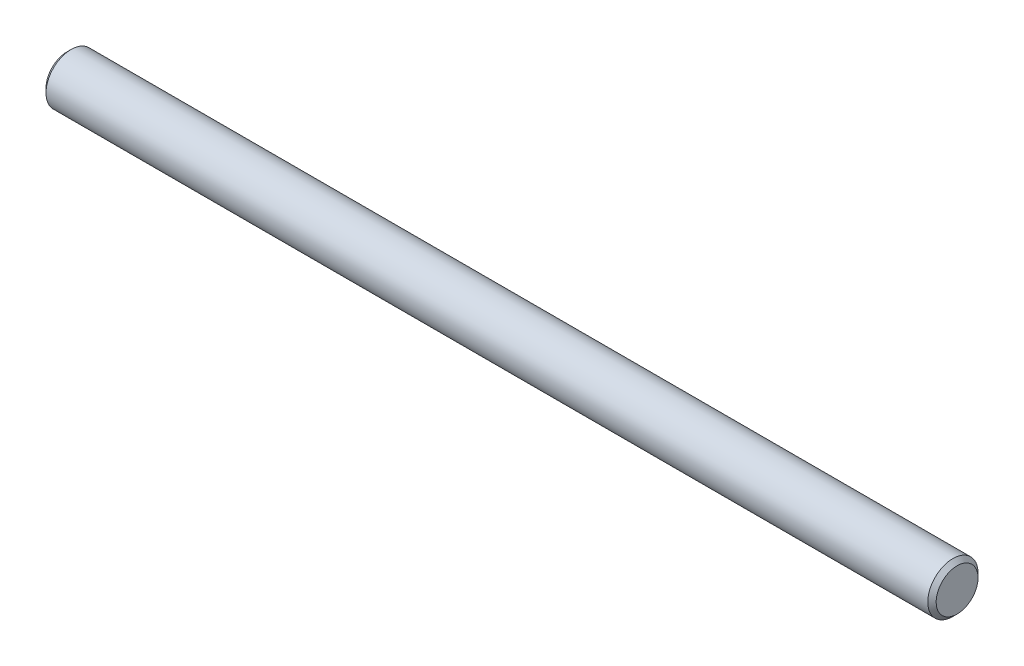
ISO-10303-21;
HEADER;
FILE_DESCRIPTION(('STEP AP214'),'2;1');
FILE_NAME('part.step','',(''),(''),'','','');
FILE_SCHEMA(('AUTOMOTIVE_DESIGN { 1 0 10303 214 1 1 1 1 }'));
ENDSEC;
DATA;
#1=APPLICATION_CONTEXT('core data for automotive mechanical design processes');
#2=APPLICATION_PROTOCOL_DEFINITION('international standard','automotive_design',2000,#1);
#3=PRODUCT_CONTEXT('',#1,'mechanical');
#4=PRODUCT('Part','Part','',(#3));
#5=PRODUCT_RELATED_PRODUCT_CATEGORY('part','',(#4));
#6=PRODUCT_DEFINITION_FORMATION('','',#4);
#7=PRODUCT_DEFINITION_CONTEXT('part definition',#1,'design');
#8=PRODUCT_DEFINITION('design','',#6,#7);
#9=PRODUCT_DEFINITION_SHAPE('','',#8);
#10=(LENGTH_UNIT() NAMED_UNIT(*) SI_UNIT(.MILLI.,.METRE.));
#11=(NAMED_UNIT(*) PLANE_ANGLE_UNIT() SI_UNIT($,.RADIAN.));
#12=(NAMED_UNIT(*) SI_UNIT($,.STERADIAN.) SOLID_ANGLE_UNIT());
#13=UNCERTAINTY_MEASURE_WITH_UNIT(LENGTH_MEASURE(1.E-05),#10,'distance_accuracy_value','');
#14=(GEOMETRIC_REPRESENTATION_CONTEXT(3) GLOBAL_UNCERTAINTY_ASSIGNED_CONTEXT((#13)) GLOBAL_UNIT_ASSIGNED_CONTEXT((#10,
#11,#12)) REPRESENTATION_CONTEXT('',''));
#15=CARTESIAN_POINT('',(0.,0.,0.));
#16=DIRECTION('',(0.,0.,1.));
#17=DIRECTION('',(1.,0.,0.));
#18=AXIS2_PLACEMENT_3D('',#15,#16,#17);
#19=CARTESIAN_POINT('',(145.503472222222,0.,0.));
#20=DIRECTION('',(-1.,0.,0.));
#21=DIRECTION('',(0.,0.,1.));
#22=AXIS2_PLACEMENT_3D('',#19,#20,#21);
#23=CONICAL_SURFACE('',#22,3.02083333333333,0.785398163397453);
#24=CARTESIAN_POINT('',(146.006944444444,0.,0.));
#25=DIRECTION('',(-1.,0.,0.));
#26=DIRECTION('',(0.,0.,1.));
#27=AXIS2_PLACEMENT_3D('',#24,#25,#26);
#28=CIRCLE('',#27,2.51736111111111);
#29=CARTESIAN_POINT('',(146.006944444444,0.,2.51736111111111));
#30=VERTEX_POINT('',#29);
#31=EDGE_CURVE('E45',#30,#30,#28,.T.);
#32=ORIENTED_EDGE('',*,*,#31,.T.);
#33=EDGE_LOOP('',(#32));
#34=FACE_BOUND('',#33,.T.);
#35=CARTESIAN_POINT('',(145.503472222222,0.,0.));
#36=DIRECTION('',(-1.,0.,0.));
#37=DIRECTION('',(0.,0.,1.));
#38=AXIS2_PLACEMENT_3D('',#35,#36,#37);
#39=CIRCLE('',#38,3.02083333333333);
#40=CARTESIAN_POINT('',(145.503472222222,0.,3.02083333333333));
#41=VERTEX_POINT('',#40);
#42=EDGE_CURVE('E10',#41,#41,#39,.T.);
#43=ORIENTED_EDGE('',*,*,#42,.F.);
#44=EDGE_LOOP('',(#43));
#45=FACE_BOUND('',#44,.T.);
#46=ADVANCED_FACE('F31',(#34,#45),#23,.T.);
#47=CARTESIAN_POINT('',(146.006944444444,0.,0.));
#48=DIRECTION('',(-1.,0.,0.));
#49=DIRECTION('',(0.,0.,1.));
#50=AXIS2_PLACEMENT_3D('',#47,#48,#49);
#51=CYLINDRICAL_SURFACE('',#50,3.02083333333334);
#52=ORIENTED_EDGE('',*,*,#42,.T.);
#53=EDGE_LOOP('',(#52));
#54=FACE_BOUND('',#53,.T.);
#55=CARTESIAN_POINT('',(39.5034722222222,0.,0.));
#56=DIRECTION('',(-1.,0.,0.));
#57=DIRECTION('',(0.,0.,1.));
#58=AXIS2_PLACEMENT_3D('',#55,#56,#57);
#59=CIRCLE('',#58,3.02083333333335);
#60=CARTESIAN_POINT('',(39.5034722222222,0.,3.02083333333335));
#61=VERTEX_POINT('',#60);
#62=EDGE_CURVE('E37',#61,#61,#59,.T.);
#63=ORIENTED_EDGE('',*,*,#62,.F.);
#64=EDGE_LOOP('',(#63));
#65=FACE_BOUND('',#64,.T.);
#66=ADVANCED_FACE('F64',(#54,#65),#51,.T.);
#67=CARTESIAN_POINT('',(39.,0.,0.));
#68=DIRECTION('',(1.,0.,0.));
#69=DIRECTION('',(0.,0.,-1.));
#70=AXIS2_PLACEMENT_3D('',#67,#68,#69);
#71=CONICAL_SURFACE('',#70,2.51736111111112,0.785398163397441);
#72=ORIENTED_EDGE('',*,*,#62,.T.);
#73=EDGE_LOOP('',(#72));
#74=FACE_BOUND('',#73,.T.);
#75=CARTESIAN_POINT('',(39.,0.,0.));
#76=DIRECTION('',(-1.,0.,0.));
#77=DIRECTION('',(0.,0.,1.));
#78=AXIS2_PLACEMENT_3D('',#75,#76,#77);
#79=CIRCLE('',#78,2.51736111111112);
#80=CARTESIAN_POINT('',(39.,0.,2.51736111111112));
#81=VERTEX_POINT('',#80);
#82=EDGE_CURVE('E41',#81,#81,#79,.T.);
#83=ORIENTED_EDGE('',*,*,#82,.F.);
#84=EDGE_LOOP('',(#83));
#85=FACE_BOUND('',#84,.T.);
#86=ADVANCED_FACE('F60',(#74,#85),#71,.T.);
#87=CARTESIAN_POINT('',(39.,0.,0.));
#88=DIRECTION('',(-1.,0.,0.));
#89=DIRECTION('',(0.,0.,1.));
#90=AXIS2_PLACEMENT_3D('',#87,#88,#89);
#91=PLANE('',#90);
#92=ORIENTED_EDGE('',*,*,#82,.T.);
#93=EDGE_LOOP('',(#92));
#94=FACE_BOUND('',#93,.T.);
#95=ADVANCED_FACE('F55',(#94),#91,.T.);
#96=CARTESIAN_POINT('',(146.006944444444,2.51736111111111,0.));
#97=DIRECTION('',(1.,0.,0.));
#98=DIRECTION('',(0.,0.,-1.));
#99=AXIS2_PLACEMENT_3D('',#96,#97,#98);
#100=PLANE('',#99);
#101=ORIENTED_EDGE('',*,*,#31,.F.);
#102=EDGE_LOOP('',(#101));
#103=FACE_BOUND('',#102,.T.);
#104=ADVANCED_FACE('F53',(#103),#100,.T.);
#105=CLOSED_SHELL('',(#46,#66,#86,#95,#104));
#106=MANIFOLD_SOLID_BREP('B2',#105);
#107=ADVANCED_BREP_SHAPE_REPRESENTATION('',(#18,#106),#14);
#108=SHAPE_DEFINITION_REPRESENTATION(#9,#107);
ENDSEC;
END-ISO-10303-21;
